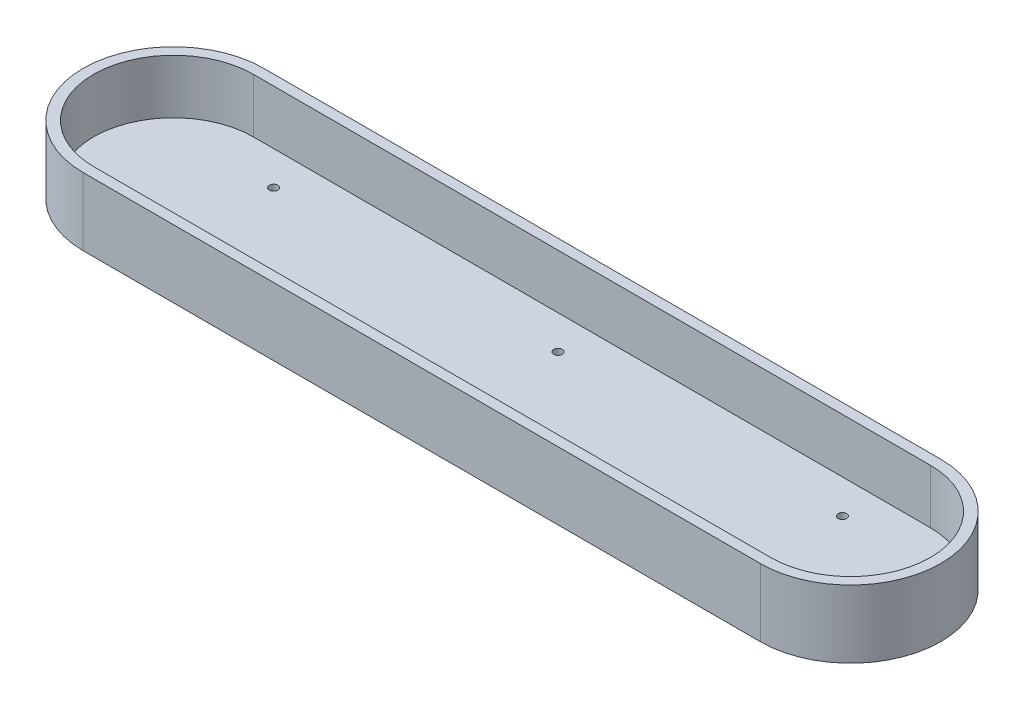
ISO-10303-21;
HEADER;
FILE_DESCRIPTION(('STEP AP214'),'2;1');
FILE_NAME('part.step','',(''),(''),'','','');
FILE_SCHEMA(('AUTOMOTIVE_DESIGN { 1 0 10303 214 1 1 1 1 }'));
ENDSEC;
DATA;
#1=APPLICATION_CONTEXT('core data for automotive mechanical design processes');
#2=APPLICATION_PROTOCOL_DEFINITION('international standard','automotive_design',2000,#1);
#3=PRODUCT_CONTEXT('',#1,'mechanical');
#4=PRODUCT('Part','Part','',(#3));
#5=PRODUCT_RELATED_PRODUCT_CATEGORY('part','',(#4));
#6=PRODUCT_DEFINITION_FORMATION('','',#4);
#7=PRODUCT_DEFINITION_CONTEXT('part definition',#1,'design');
#8=PRODUCT_DEFINITION('design','',#6,#7);
#9=PRODUCT_DEFINITION_SHAPE('','',#8);
#10=(LENGTH_UNIT() NAMED_UNIT(*) SI_UNIT(.MILLI.,.METRE.));
#11=(NAMED_UNIT(*) PLANE_ANGLE_UNIT() SI_UNIT($,.RADIAN.));
#12=(NAMED_UNIT(*) SI_UNIT($,.STERADIAN.) SOLID_ANGLE_UNIT());
#13=UNCERTAINTY_MEASURE_WITH_UNIT(LENGTH_MEASURE(1.E-05),#10,'distance_accuracy_value','');
#14=(GEOMETRIC_REPRESENTATION_CONTEXT(3) GLOBAL_UNCERTAINTY_ASSIGNED_CONTEXT((#13)) GLOBAL_UNIT_ASSIGNED_CONTEXT((#10,
#11,#12)) REPRESENTATION_CONTEXT('',''));
#15=CARTESIAN_POINT('',(0.,0.,0.));
#16=DIRECTION('',(0.,0.,1.));
#17=DIRECTION('',(1.,0.,0.));
#18=AXIS2_PLACEMENT_3D('',#15,#16,#17);
#19=CARTESIAN_POINT('',(-95.25,3.81,0.));
#20=DIRECTION('',(0.,1.,0.));
#21=DIRECTION('',(0.,0.,1.));
#22=AXIS2_PLACEMENT_3D('',#19,#20,#21);
#23=PLANE('',#22);
#24=CARTESIAN_POINT('',(-80.01,3.81,12.954));
#25=DIRECTION('',(0.,1.,0.));
#26=DIRECTION('',(0.,0.,1.));
#27=AXIS2_PLACEMENT_3D('',#24,#25,#26);
#28=CIRCLE('',#27,1.2065);
#29=CARTESIAN_POINT('',(-80.01,3.81,11.7475));
#30=VERTEX_POINT('',#29);
#31=EDGE_CURVE('E131',#30,#30,#28,.T.);
#32=ORIENTED_EDGE('',*,*,#31,.F.);
#33=EDGE_LOOP('',(#32));
#34=FACE_BOUND('',#33,.T.);
#35=CARTESIAN_POINT('',(80.01,3.81,12.954));
#36=DIRECTION('',(0.,1.,0.));
#37=DIRECTION('',(0.,0.,1.));
#38=AXIS2_PLACEMENT_3D('',#35,#36,#37);
#39=CIRCLE('',#38,1.2065);
#40=CARTESIAN_POINT('',(80.01,3.81,11.7475));
#41=VERTEX_POINT('',#40);
#42=EDGE_CURVE('E134',#41,#41,#39,.T.);
#43=ORIENTED_EDGE('',*,*,#42,.F.);
#44=EDGE_LOOP('',(#43));
#45=FACE_BOUND('',#44,.T.);
#46=CARTESIAN_POINT('',(80.01,3.81,-12.954));
#47=DIRECTION('',(0.,1.,0.));
#48=DIRECTION('',(0.,0.,1.));
#49=AXIS2_PLACEMENT_3D('',#46,#47,#48);
#50=CIRCLE('',#49,1.2065);
#51=CARTESIAN_POINT('',(80.01,3.81,-14.1605));
#52=VERTEX_POINT('',#51);
#53=EDGE_CURVE('E275',#52,#52,#50,.T.);
#54=ORIENTED_EDGE('',*,*,#53,.F.);
#55=EDGE_LOOP('',(#54));
#56=FACE_BOUND('',#55,.T.);
#57=CARTESIAN_POINT('',(-80.01,3.81,-12.954));
#58=DIRECTION('',(0.,1.,0.));
#59=DIRECTION('',(0.,0.,1.));
#60=AXIS2_PLACEMENT_3D('',#57,#58,#59);
#61=CIRCLE('',#60,1.2065);
#62=CARTESIAN_POINT('',(-80.01,3.81,-14.1605));
#63=VERTEX_POINT('',#62);
#64=EDGE_CURVE('E272',#63,#63,#61,.T.);
#65=ORIENTED_EDGE('',*,*,#64,.F.);
#66=EDGE_LOOP('',(#65));
#67=FACE_BOUND('',#66,.T.);
#68=CARTESIAN_POINT('',(0.,3.81,-12.954));
#69=DIRECTION('',(0.,1.,0.));
#70=DIRECTION('',(0.,0.,1.));
#71=AXIS2_PLACEMENT_3D('',#68,#69,#70);
#72=CIRCLE('',#71,1.2065);
#73=CARTESIAN_POINT('',(0.,3.81,-14.1605));
#74=VERTEX_POINT('',#73);
#75=EDGE_CURVE('E264',#74,#74,#72,.T.);
#76=ORIENTED_EDGE('',*,*,#75,.F.);
#77=EDGE_LOOP('',(#76));
#78=FACE_BOUND('',#77,.T.);
#79=CARTESIAN_POINT('',(0.,3.81,12.954));
#80=DIRECTION('',(0.,1.,0.));
#81=DIRECTION('',(0.,0.,1.));
#82=AXIS2_PLACEMENT_3D('',#79,#80,#81);
#83=CIRCLE('',#82,1.2065);
#84=CARTESIAN_POINT('',(0.,3.81,11.7475));
#85=VERTEX_POINT('',#84);
#86=EDGE_CURVE('E261',#85,#85,#83,.T.);
#87=ORIENTED_EDGE('',*,*,#86,.F.);
#88=EDGE_LOOP('',(#87));
#89=FACE_BOUND('',#88,.T.);
#90=CARTESIAN_POINT('',(-95.25,3.81,0.));
#91=DIRECTION('',(0.,1.,0.));
#92=DIRECTION('',(0.,0.,1.));
#93=AXIS2_PLACEMENT_3D('',#90,#91,#92);
#94=CIRCLE('',#93,22.479);
#95=CARTESIAN_POINT('',(-95.25,3.81,-22.479));
#96=VERTEX_POINT('',#95);
#97=CARTESIAN_POINT('',(-95.25,3.81,22.479));
#98=VERTEX_POINT('',#97);
#99=EDGE_CURVE('E115',#96,#98,#94,.T.);
#100=ORIENTED_EDGE('',*,*,#99,.T.);
#101=DIRECTION('',(1.,0.,0.));
#102=VECTOR('',#101,1.);
#103=CARTESIAN_POINT('',(-95.25,3.81,22.479));
#104=LINE('',#103,#102);
#105=CARTESIAN_POINT('',(95.25,3.81,22.479));
#106=VERTEX_POINT('',#105);
#107=EDGE_CURVE('E68',#98,#106,#104,.T.);
#108=ORIENTED_EDGE('',*,*,#107,.T.);
#109=CARTESIAN_POINT('',(95.25,3.81,0.));
#110=DIRECTION('',(0.,1.,0.));
#111=DIRECTION('',(0.,0.,-1.));
#112=AXIS2_PLACEMENT_3D('',#109,#110,#111);
#113=CIRCLE('',#112,22.479);
#114=CARTESIAN_POINT('',(95.25,3.81,-22.479));
#115=VERTEX_POINT('',#114);
#116=EDGE_CURVE('E53',#106,#115,#113,.T.);
#117=ORIENTED_EDGE('',*,*,#116,.T.);
#118=DIRECTION('',(-1.,0.,0.));
#119=VECTOR('',#118,1.);
#120=CARTESIAN_POINT('',(-95.25,3.81,-22.479));
#121=LINE('',#120,#119);
#122=EDGE_CURVE('E11',#115,#96,#121,.T.);
#123=ORIENTED_EDGE('',*,*,#122,.T.);
#124=EDGE_LOOP('',(#100,#108,#117,#123));
#125=FACE_BOUND('',#124,.T.);
#126=ADVANCED_FACE('F45',(#34,#45,#56,#67,#78,#89,#125),#23,.T.);
#127=CARTESIAN_POINT('',(-95.25,19.05,0.));
#128=DIRECTION('',(0.,-1.,0.));
#129=DIRECTION('',(0.,0.,-1.));
#130=AXIS2_PLACEMENT_3D('',#127,#128,#129);
#131=CYLINDRICAL_SURFACE('',#130,25.4);
#132=CARTESIAN_POINT('',(-95.25,0.,0.));
#133=DIRECTION('',(0.,-1.,0.));
#134=DIRECTION('',(0.,0.,-1.));
#135=AXIS2_PLACEMENT_3D('',#132,#133,#134);
#136=CIRCLE('',#135,25.4);
#137=CARTESIAN_POINT('',(-95.25,0.,25.4));
#138=VERTEX_POINT('',#137);
#139=CARTESIAN_POINT('',(-95.25,0.,-25.4));
#140=VERTEX_POINT('',#139);
#141=EDGE_CURVE('E142',#138,#140,#136,.T.);
#142=ORIENTED_EDGE('',*,*,#141,.F.);
#143=DIRECTION('',(0.,-1.,0.));
#144=VECTOR('',#143,1.);
#145=CARTESIAN_POINT('',(-95.25,19.05,25.4));
#146=LINE('',#145,#144);
#147=CARTESIAN_POINT('',(-95.25,19.05,25.4));
#148=VERTEX_POINT('',#147);
#149=EDGE_CURVE('E170',#148,#138,#146,.T.);
#150=ORIENTED_EDGE('',*,*,#149,.F.);
#151=CARTESIAN_POINT('',(-95.25,19.05,0.));
#152=DIRECTION('',(0.,-1.,0.));
#153=DIRECTION('',(0.,0.,-1.));
#154=AXIS2_PLACEMENT_3D('',#151,#152,#153);
#155=CIRCLE('',#154,25.4);
#156=CARTESIAN_POINT('',(-95.25,19.05,-25.4));
#157=VERTEX_POINT('',#156);
#158=EDGE_CURVE('E146',#148,#157,#155,.T.);
#159=ORIENTED_EDGE('',*,*,#158,.T.);
#160=DIRECTION('',(0.,-1.,0.));
#161=VECTOR('',#160,1.);
#162=CARTESIAN_POINT('',(-95.25,19.05,-25.4));
#163=LINE('',#162,#161);
#164=EDGE_CURVE('E159',#157,#140,#163,.T.);
#165=ORIENTED_EDGE('',*,*,#164,.T.);
#166=EDGE_LOOP('',(#142,#150,#159,#165));
#167=FACE_BOUND('',#166,.T.);
#168=ADVANCED_FACE('F193',(#167),#131,.T.);
#169=CARTESIAN_POINT('',(-95.25,19.05,25.4));
#170=DIRECTION('',(0.,0.,1.));
#171=DIRECTION('',(1.,0.,0.));
#172=AXIS2_PLACEMENT_3D('',#169,#170,#171);
#173=PLANE('',#172);
#174=DIRECTION('',(-1.,0.,0.));
#175=VECTOR('',#174,1.);
#176=CARTESIAN_POINT('',(-95.25,0.,25.4));
#177=LINE('',#176,#175);
#178=CARTESIAN_POINT('',(95.25,0.,25.4));
#179=VERTEX_POINT('',#178);
#180=EDGE_CURVE('E150',#179,#138,#177,.T.);
#181=ORIENTED_EDGE('',*,*,#180,.F.);
#182=DIRECTION('',(0.,-1.,0.));
#183=VECTOR('',#182,1.);
#184=CARTESIAN_POINT('',(95.25,19.05,25.4));
#185=LINE('',#184,#183);
#186=CARTESIAN_POINT('',(95.25,19.05,25.4));
#187=VERTEX_POINT('',#186);
#188=EDGE_CURVE('E172',#187,#179,#185,.T.);
#189=ORIENTED_EDGE('',*,*,#188,.F.);
#190=DIRECTION('',(-1.,0.,0.));
#191=VECTOR('',#190,1.);
#192=CARTESIAN_POINT('',(-95.25,19.05,25.4));
#193=LINE('',#192,#191);
#194=EDGE_CURVE('E156',#187,#148,#193,.T.);
#195=ORIENTED_EDGE('',*,*,#194,.T.);
#196=ORIENTED_EDGE('',*,*,#149,.T.);
#197=EDGE_LOOP('',(#181,#189,#195,#196));
#198=FACE_BOUND('',#197,.T.);
#199=ADVANCED_FACE('F200',(#198),#173,.T.);
#200=CARTESIAN_POINT('',(95.25,19.05,0.));
#201=DIRECTION('',(0.,-1.,0.));
#202=DIRECTION('',(0.,0.,-1.));
#203=AXIS2_PLACEMENT_3D('',#200,#201,#202);
#204=CYLINDRICAL_SURFACE('',#203,25.4);
#205=CARTESIAN_POINT('',(95.25,0.,0.));
#206=DIRECTION('',(0.,-1.,0.));
#207=DIRECTION('',(0.,0.,1.));
#208=AXIS2_PLACEMENT_3D('',#205,#206,#207);
#209=CIRCLE('',#208,25.4);
#210=CARTESIAN_POINT('',(95.25,0.,-25.4));
#211=VERTEX_POINT('',#210);
#212=EDGE_CURVE('E165',#211,#179,#209,.T.);
#213=ORIENTED_EDGE('',*,*,#212,.F.);
#214=DIRECTION('',(0.,-1.,0.));
#215=VECTOR('',#214,1.);
#216=CARTESIAN_POINT('',(95.25,19.05,-25.4));
#217=LINE('',#216,#215);
#218=CARTESIAN_POINT('',(95.25,19.05,-25.4));
#219=VERTEX_POINT('',#218);
#220=EDGE_CURVE('E174',#219,#211,#217,.T.);
#221=ORIENTED_EDGE('',*,*,#220,.F.);
#222=CARTESIAN_POINT('',(95.25,19.05,0.));
#223=DIRECTION('',(0.,-1.,0.));
#224=DIRECTION('',(0.,0.,1.));
#225=AXIS2_PLACEMENT_3D('',#222,#223,#224);
#226=CIRCLE('',#225,25.4);
#227=EDGE_CURVE('E153',#219,#187,#226,.T.);
#228=ORIENTED_EDGE('',*,*,#227,.T.);
#229=ORIENTED_EDGE('',*,*,#188,.T.);
#230=EDGE_LOOP('',(#213,#221,#228,#229));
#231=FACE_BOUND('',#230,.T.);
#232=ADVANCED_FACE('F209',(#231),#204,.T.);
#233=CARTESIAN_POINT('',(-95.25,19.05,-25.4));
#234=DIRECTION('',(0.,0.,-1.));
#235=DIRECTION('',(-1.,0.,0.));
#236=AXIS2_PLACEMENT_3D('',#233,#234,#235);
#237=PLANE('',#236);
#238=DIRECTION('',(1.,0.,0.));
#239=VECTOR('',#238,1.);
#240=CARTESIAN_POINT('',(-95.25,0.,-25.4));
#241=LINE('',#240,#239);
#242=EDGE_CURVE('E162',#140,#211,#241,.T.);
#243=ORIENTED_EDGE('',*,*,#242,.F.);
#244=ORIENTED_EDGE('',*,*,#164,.F.);
#245=DIRECTION('',(1.,0.,0.));
#246=VECTOR('',#245,1.);
#247=CARTESIAN_POINT('',(-95.25,19.05,-25.4));
#248=LINE('',#247,#246);
#249=EDGE_CURVE('E149',#157,#219,#248,.T.);
#250=ORIENTED_EDGE('',*,*,#249,.T.);
#251=ORIENTED_EDGE('',*,*,#220,.T.);
#252=EDGE_LOOP('',(#243,#244,#250,#251));
#253=FACE_BOUND('',#252,.T.);
#254=ADVANCED_FACE('F206',(#253),#237,.T.);
#255=CARTESIAN_POINT('',(-95.25,19.05,0.));
#256=DIRECTION('',(0.,-1.,0.));
#257=DIRECTION('',(0.,0.,-1.));
#258=AXIS2_PLACEMENT_3D('',#255,#256,#257);
#259=PLANE('',#258);
#260=DIRECTION('',(-1.,0.,0.));
#261=VECTOR('',#260,1.);
#262=CARTESIAN_POINT('',(95.25,19.05,22.479));
#263=LINE('',#262,#261);
#264=CARTESIAN_POINT('',(95.25,19.05,22.479));
#265=VERTEX_POINT('',#264);
#266=CARTESIAN_POINT('',(-95.25,19.05,22.479));
#267=VERTEX_POINT('',#266);
#268=EDGE_CURVE('E117',#265,#267,#263,.T.);
#269=ORIENTED_EDGE('',*,*,#268,.T.);
#270=CARTESIAN_POINT('',(-95.25,19.05,0.));
#271=DIRECTION('',(0.,-1.,0.));
#272=DIRECTION('',(0.,0.,-1.));
#273=AXIS2_PLACEMENT_3D('',#270,#271,#272);
#274=CIRCLE('',#273,22.479);
#275=CARTESIAN_POINT('',(-95.25,19.05,-22.479));
#276=VERTEX_POINT('',#275);
#277=EDGE_CURVE('E112',#267,#276,#274,.T.);
#278=ORIENTED_EDGE('',*,*,#277,.T.);
#279=DIRECTION('',(1.,0.,0.));
#280=VECTOR('',#279,1.);
#281=CARTESIAN_POINT('',(95.25,19.05,-22.479));
#282=LINE('',#281,#280);
#283=CARTESIAN_POINT('',(95.25,19.05,-22.479));
#284=VERTEX_POINT('',#283);
#285=EDGE_CURVE('E121',#276,#284,#282,.T.);
#286=ORIENTED_EDGE('',*,*,#285,.T.);
#287=CARTESIAN_POINT('',(95.25,19.05,0.));
#288=DIRECTION('',(0.,-1.,0.));
#289=DIRECTION('',(0.,0.,1.));
#290=AXIS2_PLACEMENT_3D('',#287,#288,#289);
#291=CIRCLE('',#290,22.479);
#292=EDGE_CURVE('E126',#284,#265,#291,.T.);
#293=ORIENTED_EDGE('',*,*,#292,.T.);
#294=EDGE_LOOP('',(#269,#278,#286,#293));
#295=FACE_BOUND('',#294,.T.);
#296=ORIENTED_EDGE('',*,*,#158,.F.);
#297=ORIENTED_EDGE('',*,*,#194,.F.);
#298=ORIENTED_EDGE('',*,*,#227,.F.);
#299=ORIENTED_EDGE('',*,*,#249,.F.);
#300=EDGE_LOOP('',(#296,#297,#298,#299));
#301=FACE_BOUND('',#300,.T.);
#302=ADVANCED_FACE('F128',(#295,#301),#259,.F.);
#303=CARTESIAN_POINT('',(-95.25,19.05,0.));
#304=DIRECTION('',(0.,-1.,0.));
#305=DIRECTION('',(0.,0.,-1.));
#306=AXIS2_PLACEMENT_3D('',#303,#304,#305);
#307=CYLINDRICAL_SURFACE('',#306,22.479);
#308=ORIENTED_EDGE('',*,*,#99,.F.);
#309=DIRECTION('',(0.,-1.,0.));
#310=VECTOR('',#309,1.);
#311=CARTESIAN_POINT('',(-95.25,19.05,-22.479));
#312=LINE('',#311,#310);
#313=EDGE_CURVE('E60',#276,#96,#312,.T.);
#314=ORIENTED_EDGE('',*,*,#313,.F.);
#315=ORIENTED_EDGE('',*,*,#277,.F.);
#316=DIRECTION('',(0.,-1.,0.));
#317=VECTOR('',#316,1.);
#318=CARTESIAN_POINT('',(-95.25,19.05,22.479));
#319=LINE('',#318,#317);
#320=EDGE_CURVE('E140',#267,#98,#319,.T.);
#321=ORIENTED_EDGE('',*,*,#320,.T.);
#322=EDGE_LOOP('',(#308,#314,#315,#321));
#323=FACE_BOUND('',#322,.T.);
#324=ADVANCED_FACE('F110',(#323),#307,.F.);
#325=CARTESIAN_POINT('',(95.25,19.05,22.479));
#326=DIRECTION('',(0.,0.,1.));
#327=DIRECTION('',(1.,0.,0.));
#328=AXIS2_PLACEMENT_3D('',#325,#326,#327);
#329=PLANE('',#328);
#330=ORIENTED_EDGE('',*,*,#107,.F.);
#331=ORIENTED_EDGE('',*,*,#320,.F.);
#332=ORIENTED_EDGE('',*,*,#268,.F.);
#333=DIRECTION('',(0.,-1.,0.));
#334=VECTOR('',#333,1.);
#335=CARTESIAN_POINT('',(95.25,19.05,22.479));
#336=LINE('',#335,#334);
#337=EDGE_CURVE('E143',#265,#106,#336,.T.);
#338=ORIENTED_EDGE('',*,*,#337,.T.);
#339=EDGE_LOOP('',(#330,#331,#332,#338));
#340=FACE_BOUND('',#339,.T.);
#341=ADVANCED_FACE('F182',(#340),#329,.F.);
#342=CARTESIAN_POINT('',(95.25,19.05,0.));
#343=DIRECTION('',(0.,-1.,0.));
#344=DIRECTION('',(0.,0.,-1.));
#345=AXIS2_PLACEMENT_3D('',#342,#343,#344);
#346=CYLINDRICAL_SURFACE('',#345,22.479);
#347=ORIENTED_EDGE('',*,*,#116,.F.);
#348=ORIENTED_EDGE('',*,*,#337,.F.);
#349=ORIENTED_EDGE('',*,*,#292,.F.);
#350=DIRECTION('',(0.,-1.,0.));
#351=VECTOR('',#350,1.);
#352=CARTESIAN_POINT('',(95.25,19.05,-22.479));
#353=LINE('',#352,#351);
#354=EDGE_CURVE('E116',#284,#115,#353,.T.);
#355=ORIENTED_EDGE('',*,*,#354,.T.);
#356=EDGE_LOOP('',(#347,#348,#349,#355));
#357=FACE_BOUND('',#356,.T.);
#358=ADVANCED_FACE('F181',(#357),#346,.F.);
#359=CARTESIAN_POINT('',(95.25,19.05,-22.479));
#360=DIRECTION('',(0.,0.,-1.));
#361=DIRECTION('',(-1.,0.,0.));
#362=AXIS2_PLACEMENT_3D('',#359,#360,#361);
#363=PLANE('',#362);
#364=ORIENTED_EDGE('',*,*,#122,.F.);
#365=ORIENTED_EDGE('',*,*,#354,.F.);
#366=ORIENTED_EDGE('',*,*,#285,.F.);
#367=ORIENTED_EDGE('',*,*,#313,.T.);
#368=EDGE_LOOP('',(#364,#365,#366,#367));
#369=FACE_BOUND('',#368,.T.);
#370=ADVANCED_FACE('F122',(#369),#363,.F.);
#371=CARTESIAN_POINT('',(-95.25,0.,0.));
#372=DIRECTION('',(0.,1.,0.));
#373=DIRECTION('',(0.,0.,1.));
#374=AXIS2_PLACEMENT_3D('',#371,#372,#373);
#375=PLANE('',#374);
#376=CARTESIAN_POINT('',(-80.01,0.,12.954));
#377=DIRECTION('',(0.,-1.,0.));
#378=DIRECTION('',(0.,0.,-1.));
#379=AXIS2_PLACEMENT_3D('',#376,#377,#378);
#380=CIRCLE('',#379,1.2065);
#381=CARTESIAN_POINT('',(-80.01,0.,11.7475));
#382=VERTEX_POINT('',#381);
#383=EDGE_CURVE('E231',#382,#382,#380,.T.);
#384=ORIENTED_EDGE('',*,*,#383,.F.);
#385=EDGE_LOOP('',(#384));
#386=FACE_BOUND('',#385,.T.);
#387=CARTESIAN_POINT('',(80.01,0.,12.954));
#388=DIRECTION('',(0.,-1.,0.));
#389=DIRECTION('',(0.,0.,1.));
#390=AXIS2_PLACEMENT_3D('',#387,#388,#389);
#391=CIRCLE('',#390,1.2065);
#392=CARTESIAN_POINT('',(80.01,0.,11.7475));
#393=VERTEX_POINT('',#392);
#394=EDGE_CURVE('E235',#393,#393,#391,.T.);
#395=ORIENTED_EDGE('',*,*,#394,.F.);
#396=EDGE_LOOP('',(#395));
#397=FACE_BOUND('',#396,.T.);
#398=CARTESIAN_POINT('',(80.01,0.,-12.954));
#399=DIRECTION('',(0.,-1.,0.));
#400=DIRECTION('',(0.,0.,-1.));
#401=AXIS2_PLACEMENT_3D('',#398,#399,#400);
#402=CIRCLE('',#401,1.2065);
#403=CARTESIAN_POINT('',(80.01,0.,-14.1605));
#404=VERTEX_POINT('',#403);
#405=EDGE_CURVE('E239',#404,#404,#402,.T.);
#406=ORIENTED_EDGE('',*,*,#405,.F.);
#407=EDGE_LOOP('',(#406));
#408=FACE_BOUND('',#407,.T.);
#409=CARTESIAN_POINT('',(-80.01,0.,-12.954));
#410=DIRECTION('',(0.,-1.,0.));
#411=DIRECTION('',(0.,0.,1.));
#412=AXIS2_PLACEMENT_3D('',#409,#410,#411);
#413=CIRCLE('',#412,1.2065);
#414=CARTESIAN_POINT('',(-80.01,0.,-14.1605));
#415=VERTEX_POINT('',#414);
#416=EDGE_CURVE('E243',#415,#415,#413,.T.);
#417=ORIENTED_EDGE('',*,*,#416,.F.);
#418=EDGE_LOOP('',(#417));
#419=FACE_BOUND('',#418,.T.);
#420=CARTESIAN_POINT('',(0.,0.,-12.954));
#421=DIRECTION('',(0.,-1.,0.));
#422=DIRECTION('',(0.,0.,1.));
#423=AXIS2_PLACEMENT_3D('',#420,#421,#422);
#424=CIRCLE('',#423,1.2065);
#425=CARTESIAN_POINT('',(0.,0.,-14.1605));
#426=VERTEX_POINT('',#425);
#427=EDGE_CURVE('E247',#426,#426,#424,.T.);
#428=ORIENTED_EDGE('',*,*,#427,.F.);
#429=EDGE_LOOP('',(#428));
#430=FACE_BOUND('',#429,.T.);
#431=CARTESIAN_POINT('',(0.,0.,12.954));
#432=DIRECTION('',(0.,-1.,0.));
#433=DIRECTION('',(0.,0.,-1.));
#434=AXIS2_PLACEMENT_3D('',#431,#432,#433);
#435=CIRCLE('',#434,1.2065);
#436=CARTESIAN_POINT('',(0.,0.,11.7475));
#437=VERTEX_POINT('',#436);
#438=EDGE_CURVE('E251',#437,#437,#435,.T.);
#439=ORIENTED_EDGE('',*,*,#438,.F.);
#440=EDGE_LOOP('',(#439));
#441=FACE_BOUND('',#440,.T.);
#442=ORIENTED_EDGE('',*,*,#141,.T.);
#443=ORIENTED_EDGE('',*,*,#242,.T.);
#444=ORIENTED_EDGE('',*,*,#212,.T.);
#445=ORIENTED_EDGE('',*,*,#180,.T.);
#446=EDGE_LOOP('',(#442,#443,#444,#445));
#447=FACE_BOUND('',#446,.T.);
#448=ADVANCED_FACE('F47',(#386,#397,#408,#419,#430,#441,#447),#375,.F.);
#449=CARTESIAN_POINT('',(0.,19.05,12.954));
#450=DIRECTION('',(0.,-1.,0.));
#451=DIRECTION('',(0.,0.,-1.));
#452=AXIS2_PLACEMENT_3D('',#449,#450,#451);
#453=CYLINDRICAL_SURFACE('',#452,1.2065);
#454=CARTESIAN_POINT('',(0.,3.81,11.7475));
#455=CARTESIAN_POINT('',(0.,3.7703125,11.7475));
#456=CARTESIAN_POINT('',(0.,3.730625,11.7475));
#457=CARTESIAN_POINT('',(0.,3.65125,11.7475));
#458=CARTESIAN_POINT('',(0.,3.6115625,11.7475));
#459=CARTESIAN_POINT('',(0.,3.5321875,11.7475));
#460=CARTESIAN_POINT('',(0.,3.4925,11.7475));
#461=CARTESIAN_POINT('',(0.,3.413125,11.7475));
#462=CARTESIAN_POINT('',(0.,3.3734375,11.7475));
#463=CARTESIAN_POINT('',(0.,3.2940625,11.7475));
#464=CARTESIAN_POINT('',(0.,3.254375,11.7475));
#465=CARTESIAN_POINT('',(0.,3.175,11.7475));
#466=CARTESIAN_POINT('',(0.,3.1353125,11.7475));
#467=CARTESIAN_POINT('',(0.,3.0559375,11.7475));
#468=CARTESIAN_POINT('',(0.,3.01625,11.7475));
#469=CARTESIAN_POINT('',(0.,2.936875,11.7475));
#470=CARTESIAN_POINT('',(0.,2.8971875,11.7475));
#471=CARTESIAN_POINT('',(0.,2.8178125,11.7475));
#472=CARTESIAN_POINT('',(0.,2.778125,11.7475));
#473=CARTESIAN_POINT('',(0.,2.69875,11.7475));
#474=CARTESIAN_POINT('',(0.,2.6590625,11.7475));
#475=CARTESIAN_POINT('',(0.,2.5796875,11.7475));
#476=CARTESIAN_POINT('',(0.,2.54,11.7475));
#477=CARTESIAN_POINT('',(0.,2.460625,11.7475));
#478=CARTESIAN_POINT('',(0.,2.4209375,11.7475));
#479=CARTESIAN_POINT('',(0.,2.3415625,11.7475));
#480=CARTESIAN_POINT('',(0.,2.301875,11.7475));
#481=CARTESIAN_POINT('',(0.,2.2225,11.7475));
#482=CARTESIAN_POINT('',(0.,2.1828125,11.7475));
#483=CARTESIAN_POINT('',(0.,2.1034375,11.7475));
#484=CARTESIAN_POINT('',(0.,2.06375,11.7475));
#485=CARTESIAN_POINT('',(0.,1.984375,11.7475));
#486=CARTESIAN_POINT('',(0.,1.9446875,11.7475));
#487=CARTESIAN_POINT('',(0.,1.8653125,11.7475));
#488=CARTESIAN_POINT('',(0.,1.825625,11.7475));
#489=CARTESIAN_POINT('',(0.,1.74625,11.7475));
#490=CARTESIAN_POINT('',(0.,1.7065625,11.7475));
#491=CARTESIAN_POINT('',(0.,1.6271875,11.7475));
#492=CARTESIAN_POINT('',(0.,1.5875,11.7475));
#493=CARTESIAN_POINT('',(0.,1.508125,11.7475));
#494=CARTESIAN_POINT('',(0.,1.4684375,11.7475));
#495=CARTESIAN_POINT('',(0.,1.3890625,11.7475));
#496=CARTESIAN_POINT('',(0.,1.349375,11.7475));
#497=CARTESIAN_POINT('',(0.,1.27,11.7475));
#498=CARTESIAN_POINT('',(0.,1.2303125,11.7475));
#499=CARTESIAN_POINT('',(0.,1.1509375,11.7475));
#500=CARTESIAN_POINT('',(0.,1.11125,11.7475));
#501=CARTESIAN_POINT('',(0.,1.031875,11.7475));
#502=CARTESIAN_POINT('',(0.,0.992187500000002,11.7475));
#503=CARTESIAN_POINT('',(0.,0.912812500000001,11.7475));
#504=CARTESIAN_POINT('',(0.,0.873125,11.7475));
#505=CARTESIAN_POINT('',(0.,0.793749999999999,11.7475));
#506=CARTESIAN_POINT('',(0.,0.7540625,11.7475));
#507=CARTESIAN_POINT('',(0.,0.6746875,11.7475));
#508=CARTESIAN_POINT('',(0.,0.635,11.7475));
#509=CARTESIAN_POINT('',(0.,0.555625000000001,11.7475));
#510=CARTESIAN_POINT('',(0.,0.515937500000001,11.7475));
#511=CARTESIAN_POINT('',(0.,0.436562500000001,11.7475));
#512=CARTESIAN_POINT('',(0.,0.396875000000001,11.7475));
#513=CARTESIAN_POINT('',(0.,0.317500000000001,11.7475));
#514=CARTESIAN_POINT('',(0.,0.2778125,11.7475));
#515=CARTESIAN_POINT('',(0.,0.198437499999999,11.7475));
#516=CARTESIAN_POINT('',(0.,0.158749999999999,11.7475));
#517=CARTESIAN_POINT('',(0.,0.0793749999999996,11.7475));
#518=CARTESIAN_POINT('',(0.,0.0396874999999998,11.7475));
#519=CARTESIAN_POINT('',(0.,0.,11.7475));
#520=B_SPLINE_CURVE_WITH_KNOTS('',3,(#454,#455,#456,#457,#458,#459,#460,#461,#462,#463,#464,
#465,#466,#467,#468,#469,#470,#471,#472,#473,#474,#475,#476,#477,#478,#479,#480,#481,#482,#483,
#484,#485,#486,#487,#488,#489,#490,#491,#492,#493,#494,#495,#496,#497,#498,#499,#500,#501,#502,
#503,#504,#505,#506,#507,#508,#509,#510,#511,#512,#513,#514,#515,#516,#517,#518,#519),
.UNSPECIFIED.,.F.,.F.,(4,2,2,2,2,2,2,2,2,2,2,2,2,2,2,2,2,2,2,2,2,2,2,2,2,2,2,2,2,2,2,2,4),(0.,
0.119062499999999,0.238125,0.3571875,0.476249999999999,0.595312499999999,0.714374999999998,
0.833437499999997,0.9525,1.0715625,1.190625,1.3096875,1.42875,1.5478125,1.666875,1.7859375,
1.905,2.0240625,2.143125,2.2621875,2.38125,2.5003125,2.619375,2.7384375,2.8575,2.9765625,
3.095625,3.2146875,3.33375,3.4528125,3.571875,3.6909375,3.81),.UNSPECIFIED.);
#521=EDGE_CURVE('BSEAM221',#85,#437,#520,.T.);
#522=ORIENTED_EDGE('',*,*,#86,.T.);
#523=ORIENTED_EDGE('',*,*,#438,.T.);
#524=ORIENTED_EDGE('',*,*,#521,.T.);
#525=ORIENTED_EDGE('',*,*,#521,.F.);
#526=EDGE_LOOP('',(#522,#524,#523,#525));
#527=FACE_BOUND('',#526,.T.);
#528=ADVANCED_FACE('F221',(#527),#453,.F.);
#529=CARTESIAN_POINT('',(0.,19.05,-12.954));
#530=DIRECTION('',(0.,-1.,0.));
#531=DIRECTION('',(0.,0.,-1.));
#532=AXIS2_PLACEMENT_3D('',#529,#530,#531);
#533=CYLINDRICAL_SURFACE('',#532,1.2065);
#534=CARTESIAN_POINT('',(0.,3.81,-14.1605));
#535=CARTESIAN_POINT('',(0.,3.7703125,-14.1605));
#536=CARTESIAN_POINT('',(0.,3.730625,-14.1605));
#537=CARTESIAN_POINT('',(0.,3.65125,-14.1605));
#538=CARTESIAN_POINT('',(0.,3.6115625,-14.1605));
#539=CARTESIAN_POINT('',(0.,3.5321875,-14.1605));
#540=CARTESIAN_POINT('',(0.,3.4925,-14.1605));
#541=CARTESIAN_POINT('',(0.,3.413125,-14.1605));
#542=CARTESIAN_POINT('',(0.,3.3734375,-14.1605));
#543=CARTESIAN_POINT('',(0.,3.2940625,-14.1605));
#544=CARTESIAN_POINT('',(0.,3.254375,-14.1605));
#545=CARTESIAN_POINT('',(0.,3.175,-14.1605));
#546=CARTESIAN_POINT('',(0.,3.1353125,-14.1605));
#547=CARTESIAN_POINT('',(0.,3.0559375,-14.1605));
#548=CARTESIAN_POINT('',(0.,3.01625,-14.1605));
#549=CARTESIAN_POINT('',(0.,2.936875,-14.1605));
#550=CARTESIAN_POINT('',(0.,2.8971875,-14.1605));
#551=CARTESIAN_POINT('',(0.,2.8178125,-14.1605));
#552=CARTESIAN_POINT('',(0.,2.778125,-14.1605));
#553=CARTESIAN_POINT('',(0.,2.69875,-14.1605));
#554=CARTESIAN_POINT('',(0.,2.6590625,-14.1605));
#555=CARTESIAN_POINT('',(0.,2.5796875,-14.1605));
#556=CARTESIAN_POINT('',(0.,2.54,-14.1605));
#557=CARTESIAN_POINT('',(0.,2.460625,-14.1605));
#558=CARTESIAN_POINT('',(0.,2.4209375,-14.1605));
#559=CARTESIAN_POINT('',(0.,2.3415625,-14.1605));
#560=CARTESIAN_POINT('',(0.,2.301875,-14.1605));
#561=CARTESIAN_POINT('',(0.,2.2225,-14.1605));
#562=CARTESIAN_POINT('',(0.,2.1828125,-14.1605));
#563=CARTESIAN_POINT('',(0.,2.1034375,-14.1605));
#564=CARTESIAN_POINT('',(0.,2.06375,-14.1605));
#565=CARTESIAN_POINT('',(0.,1.984375,-14.1605));
#566=CARTESIAN_POINT('',(0.,1.9446875,-14.1605));
#567=CARTESIAN_POINT('',(0.,1.8653125,-14.1605));
#568=CARTESIAN_POINT('',(0.,1.825625,-14.1605));
#569=CARTESIAN_POINT('',(0.,1.74625,-14.1605));
#570=CARTESIAN_POINT('',(0.,1.7065625,-14.1605));
#571=CARTESIAN_POINT('',(0.,1.6271875,-14.1605));
#572=CARTESIAN_POINT('',(0.,1.5875,-14.1605));
#573=CARTESIAN_POINT('',(0.,1.508125,-14.1605));
#574=CARTESIAN_POINT('',(0.,1.4684375,-14.1605));
#575=CARTESIAN_POINT('',(0.,1.3890625,-14.1605));
#576=CARTESIAN_POINT('',(0.,1.349375,-14.1605));
#577=CARTESIAN_POINT('',(0.,1.27,-14.1605));
#578=CARTESIAN_POINT('',(0.,1.2303125,-14.1605));
#579=CARTESIAN_POINT('',(0.,1.1509375,-14.1605));
#580=CARTESIAN_POINT('',(0.,1.11125,-14.1605));
#581=CARTESIAN_POINT('',(0.,1.031875,-14.1605));
#582=CARTESIAN_POINT('',(0.,0.992187500000002,-14.1605));
#583=CARTESIAN_POINT('',(0.,0.912812500000001,-14.1605));
#584=CARTESIAN_POINT('',(0.,0.873125,-14.1605));
#585=CARTESIAN_POINT('',(0.,0.793749999999999,-14.1605));
#586=CARTESIAN_POINT('',(0.,0.7540625,-14.1605));
#587=CARTESIAN_POINT('',(0.,0.6746875,-14.1605));
#588=CARTESIAN_POINT('',(0.,0.635,-14.1605));
#589=CARTESIAN_POINT('',(0.,0.555625000000001,-14.1605));
#590=CARTESIAN_POINT('',(0.,0.515937500000001,-14.1605));
#591=CARTESIAN_POINT('',(0.,0.436562500000001,-14.1605));
#592=CARTESIAN_POINT('',(0.,0.396875000000001,-14.1605));
#593=CARTESIAN_POINT('',(0.,0.317500000000001,-14.1605));
#594=CARTESIAN_POINT('',(0.,0.2778125,-14.1605));
#595=CARTESIAN_POINT('',(0.,0.198437499999999,-14.1605));
#596=CARTESIAN_POINT('',(0.,0.158749999999999,-14.1605));
#597=CARTESIAN_POINT('',(0.,0.0793749999999996,-14.1605));
#598=CARTESIAN_POINT('',(0.,0.0396874999999998,-14.1605));
#599=CARTESIAN_POINT('',(0.,0.,-14.1605));
#600=B_SPLINE_CURVE_WITH_KNOTS('',3,(#534,#535,#536,#537,#538,#539,#540,#541,#542,#543,#544,
#545,#546,#547,#548,#549,#550,#551,#552,#553,#554,#555,#556,#557,#558,#559,#560,#561,#562,#563,
#564,#565,#566,#567,#568,#569,#570,#571,#572,#573,#574,#575,#576,#577,#578,#579,#580,#581,#582,
#583,#584,#585,#586,#587,#588,#589,#590,#591,#592,#593,#594,#595,#596,#597,#598,#599),
.UNSPECIFIED.,.F.,.F.,(4,2,2,2,2,2,2,2,2,2,2,2,2,2,2,2,2,2,2,2,2,2,2,2,2,2,2,2,2,2,2,2,4),(0.,
0.119062499999999,0.238125,0.3571875,0.476249999999999,0.595312499999999,0.714374999999998,
0.833437499999997,0.9525,1.0715625,1.190625,1.3096875,1.42875,1.5478125,1.666875,1.7859375,
1.905,2.0240625,2.143125,2.2621875,2.38125,2.5003125,2.619375,2.7384375,2.8575,2.9765625,
3.095625,3.2146875,3.33375,3.4528125,3.571875,3.6909375,3.81),.UNSPECIFIED.);
#601=EDGE_CURVE('BSEAM226',#74,#426,#600,.T.);
#602=ORIENTED_EDGE('',*,*,#75,.T.);
#603=ORIENTED_EDGE('',*,*,#427,.T.);
#604=ORIENTED_EDGE('',*,*,#601,.T.);
#605=ORIENTED_EDGE('',*,*,#601,.F.);
#606=EDGE_LOOP('',(#602,#604,#603,#605));
#607=FACE_BOUND('',#606,.T.);
#608=ADVANCED_FACE('F226',(#607),#533,.F.);
#609=CARTESIAN_POINT('',(-80.01,19.05,-12.954));
#610=DIRECTION('',(0.,-1.,0.));
#611=DIRECTION('',(0.,0.,-1.));
#612=AXIS2_PLACEMENT_3D('',#609,#610,#611);
#613=CYLINDRICAL_SURFACE('',#612,1.2065);
#614=CARTESIAN_POINT('',(-80.01,3.81,-14.1605));
#615=CARTESIAN_POINT('',(-80.01,3.7703125,-14.1605));
#616=CARTESIAN_POINT('',(-80.01,3.730625,-14.1605));
#617=CARTESIAN_POINT('',(-80.01,3.65125,-14.1605));
#618=CARTESIAN_POINT('',(-80.01,3.6115625,-14.1605));
#619=CARTESIAN_POINT('',(-80.01,3.5321875,-14.1605));
#620=CARTESIAN_POINT('',(-80.01,3.4925,-14.1605));
#621=CARTESIAN_POINT('',(-80.01,3.413125,-14.1605));
#622=CARTESIAN_POINT('',(-80.01,3.3734375,-14.1605));
#623=CARTESIAN_POINT('',(-80.01,3.2940625,-14.1605));
#624=CARTESIAN_POINT('',(-80.01,3.254375,-14.1605));
#625=CARTESIAN_POINT('',(-80.01,3.175,-14.1605));
#626=CARTESIAN_POINT('',(-80.01,3.1353125,-14.1605));
#627=CARTESIAN_POINT('',(-80.01,3.0559375,-14.1605));
#628=CARTESIAN_POINT('',(-80.01,3.01625,-14.1605));
#629=CARTESIAN_POINT('',(-80.01,2.936875,-14.1605));
#630=CARTESIAN_POINT('',(-80.01,2.8971875,-14.1605));
#631=CARTESIAN_POINT('',(-80.01,2.8178125,-14.1605));
#632=CARTESIAN_POINT('',(-80.01,2.778125,-14.1605));
#633=CARTESIAN_POINT('',(-80.01,2.69875,-14.1605));
#634=CARTESIAN_POINT('',(-80.01,2.6590625,-14.1605));
#635=CARTESIAN_POINT('',(-80.01,2.5796875,-14.1605));
#636=CARTESIAN_POINT('',(-80.01,2.54,-14.1605));
#637=CARTESIAN_POINT('',(-80.01,2.460625,-14.1605));
#638=CARTESIAN_POINT('',(-80.01,2.4209375,-14.1605));
#639=CARTESIAN_POINT('',(-80.01,2.3415625,-14.1605));
#640=CARTESIAN_POINT('',(-80.01,2.301875,-14.1605));
#641=CARTESIAN_POINT('',(-80.01,2.2225,-14.1605));
#642=CARTESIAN_POINT('',(-80.01,2.1828125,-14.1605));
#643=CARTESIAN_POINT('',(-80.01,2.1034375,-14.1605));
#644=CARTESIAN_POINT('',(-80.01,2.06375,-14.1605));
#645=CARTESIAN_POINT('',(-80.01,1.984375,-14.1605));
#646=CARTESIAN_POINT('',(-80.01,1.9446875,-14.1605));
#647=CARTESIAN_POINT('',(-80.01,1.8653125,-14.1605));
#648=CARTESIAN_POINT('',(-80.01,1.825625,-14.1605));
#649=CARTESIAN_POINT('',(-80.01,1.74625,-14.1605));
#650=CARTESIAN_POINT('',(-80.01,1.7065625,-14.1605));
#651=CARTESIAN_POINT('',(-80.01,1.6271875,-14.1605));
#652=CARTESIAN_POINT('',(-80.01,1.5875,-14.1605));
#653=CARTESIAN_POINT('',(-80.01,1.508125,-14.1605));
#654=CARTESIAN_POINT('',(-80.01,1.4684375,-14.1605));
#655=CARTESIAN_POINT('',(-80.01,1.3890625,-14.1605));
#656=CARTESIAN_POINT('',(-80.01,1.349375,-14.1605));
#657=CARTESIAN_POINT('',(-80.01,1.27,-14.1605));
#658=CARTESIAN_POINT('',(-80.01,1.2303125,-14.1605));
#659=CARTESIAN_POINT('',(-80.01,1.1509375,-14.1605));
#660=CARTESIAN_POINT('',(-80.01,1.11125,-14.1605));
#661=CARTESIAN_POINT('',(-80.01,1.031875,-14.1605));
#662=CARTESIAN_POINT('',(-80.01,0.992187500000002,-14.1605));
#663=CARTESIAN_POINT('',(-80.01,0.912812500000001,-14.1605));
#664=CARTESIAN_POINT('',(-80.01,0.873125,-14.1605));
#665=CARTESIAN_POINT('',(-80.01,0.793749999999999,-14.1605));
#666=CARTESIAN_POINT('',(-80.01,0.7540625,-14.1605));
#667=CARTESIAN_POINT('',(-80.01,0.6746875,-14.1605));
#668=CARTESIAN_POINT('',(-80.01,0.635,-14.1605));
#669=CARTESIAN_POINT('',(-80.01,0.555625000000001,-14.1605));
#670=CARTESIAN_POINT('',(-80.01,0.515937500000001,-14.1605));
#671=CARTESIAN_POINT('',(-80.01,0.436562500000001,-14.1605));
#672=CARTESIAN_POINT('',(-80.01,0.396875000000001,-14.1605));
#673=CARTESIAN_POINT('',(-80.01,0.317500000000001,-14.1605));
#674=CARTESIAN_POINT('',(-80.01,0.2778125,-14.1605));
#675=CARTESIAN_POINT('',(-80.01,0.198437499999999,-14.1605));
#676=CARTESIAN_POINT('',(-80.01,0.158749999999999,-14.1605));
#677=CARTESIAN_POINT('',(-80.01,0.0793749999999996,-14.1605));
#678=CARTESIAN_POINT('',(-80.01,0.0396874999999998,-14.1605));
#679=CARTESIAN_POINT('',(-80.01,0.,-14.1605));
#680=B_SPLINE_CURVE_WITH_KNOTS('',3,(#614,#615,#616,#617,#618,#619,#620,#621,#622,#623,#624,
#625,#626,#627,#628,#629,#630,#631,#632,#633,#634,#635,#636,#637,#638,#639,#640,#641,#642,#643,
#644,#645,#646,#647,#648,#649,#650,#651,#652,#653,#654,#655,#656,#657,#658,#659,#660,#661,#662,
#663,#664,#665,#666,#667,#668,#669,#670,#671,#672,#673,#674,#675,#676,#677,#678,#679),
.UNSPECIFIED.,.F.,.F.,(4,2,2,2,2,2,2,2,2,2,2,2,2,2,2,2,2,2,2,2,2,2,2,2,2,2,2,2,2,2,2,2,4),(0.,
0.119062499999999,0.238125,0.3571875,0.476249999999999,0.595312499999999,0.714374999999998,
0.833437499999997,0.9525,1.0715625,1.190625,1.3096875,1.42875,1.5478125,1.666875,1.7859375,
1.905,2.0240625,2.143125,2.2621875,2.38125,2.5003125,2.619375,2.7384375,2.8575,2.9765625,
3.095625,3.2146875,3.33375,3.4528125,3.571875,3.6909375,3.81),.UNSPECIFIED.);
#681=EDGE_CURVE('BSEAM293',#63,#415,#680,.T.);
#682=ORIENTED_EDGE('',*,*,#64,.T.);
#683=ORIENTED_EDGE('',*,*,#416,.T.);
#684=ORIENTED_EDGE('',*,*,#681,.T.);
#685=ORIENTED_EDGE('',*,*,#681,.F.);
#686=EDGE_LOOP('',(#682,#684,#683,#685));
#687=FACE_BOUND('',#686,.T.);
#688=ADVANCED_FACE('F293',(#687),#613,.F.);
#689=CARTESIAN_POINT('',(80.01,19.05,-12.954));
#690=DIRECTION('',(0.,-1.,0.));
#691=DIRECTION('',(0.,0.,-1.));
#692=AXIS2_PLACEMENT_3D('',#689,#690,#691);
#693=CYLINDRICAL_SURFACE('',#692,1.2065);
#694=CARTESIAN_POINT('',(80.01,3.81,-14.1605));
#695=CARTESIAN_POINT('',(80.01,3.7703125,-14.1605));
#696=CARTESIAN_POINT('',(80.01,3.730625,-14.1605));
#697=CARTESIAN_POINT('',(80.01,3.65125,-14.1605));
#698=CARTESIAN_POINT('',(80.01,3.6115625,-14.1605));
#699=CARTESIAN_POINT('',(80.01,3.5321875,-14.1605));
#700=CARTESIAN_POINT('',(80.01,3.4925,-14.1605));
#701=CARTESIAN_POINT('',(80.01,3.413125,-14.1605));
#702=CARTESIAN_POINT('',(80.01,3.3734375,-14.1605));
#703=CARTESIAN_POINT('',(80.01,3.2940625,-14.1605));
#704=CARTESIAN_POINT('',(80.01,3.254375,-14.1605));
#705=CARTESIAN_POINT('',(80.01,3.175,-14.1605));
#706=CARTESIAN_POINT('',(80.01,3.1353125,-14.1605));
#707=CARTESIAN_POINT('',(80.01,3.0559375,-14.1605));
#708=CARTESIAN_POINT('',(80.01,3.01625,-14.1605));
#709=CARTESIAN_POINT('',(80.01,2.936875,-14.1605));
#710=CARTESIAN_POINT('',(80.01,2.8971875,-14.1605));
#711=CARTESIAN_POINT('',(80.01,2.8178125,-14.1605));
#712=CARTESIAN_POINT('',(80.01,2.778125,-14.1605));
#713=CARTESIAN_POINT('',(80.01,2.69875,-14.1605));
#714=CARTESIAN_POINT('',(80.01,2.6590625,-14.1605));
#715=CARTESIAN_POINT('',(80.01,2.5796875,-14.1605));
#716=CARTESIAN_POINT('',(80.01,2.54,-14.1605));
#717=CARTESIAN_POINT('',(80.01,2.460625,-14.1605));
#718=CARTESIAN_POINT('',(80.01,2.4209375,-14.1605));
#719=CARTESIAN_POINT('',(80.01,2.3415625,-14.1605));
#720=CARTESIAN_POINT('',(80.01,2.301875,-14.1605));
#721=CARTESIAN_POINT('',(80.01,2.2225,-14.1605));
#722=CARTESIAN_POINT('',(80.01,2.1828125,-14.1605));
#723=CARTESIAN_POINT('',(80.01,2.1034375,-14.1605));
#724=CARTESIAN_POINT('',(80.01,2.06375,-14.1605));
#725=CARTESIAN_POINT('',(80.01,1.984375,-14.1605));
#726=CARTESIAN_POINT('',(80.01,1.9446875,-14.1605));
#727=CARTESIAN_POINT('',(80.01,1.8653125,-14.1605));
#728=CARTESIAN_POINT('',(80.01,1.825625,-14.1605));
#729=CARTESIAN_POINT('',(80.01,1.74625,-14.1605));
#730=CARTESIAN_POINT('',(80.01,1.7065625,-14.1605));
#731=CARTESIAN_POINT('',(80.01,1.6271875,-14.1605));
#732=CARTESIAN_POINT('',(80.01,1.5875,-14.1605));
#733=CARTESIAN_POINT('',(80.01,1.508125,-14.1605));
#734=CARTESIAN_POINT('',(80.01,1.4684375,-14.1605));
#735=CARTESIAN_POINT('',(80.01,1.3890625,-14.1605));
#736=CARTESIAN_POINT('',(80.01,1.349375,-14.1605));
#737=CARTESIAN_POINT('',(80.01,1.27,-14.1605));
#738=CARTESIAN_POINT('',(80.01,1.2303125,-14.1605));
#739=CARTESIAN_POINT('',(80.01,1.1509375,-14.1605));
#740=CARTESIAN_POINT('',(80.01,1.11125,-14.1605));
#741=CARTESIAN_POINT('',(80.01,1.031875,-14.1605));
#742=CARTESIAN_POINT('',(80.01,0.992187500000002,-14.1605));
#743=CARTESIAN_POINT('',(80.01,0.912812500000001,-14.1605));
#744=CARTESIAN_POINT('',(80.01,0.873125,-14.1605));
#745=CARTESIAN_POINT('',(80.01,0.793749999999999,-14.1605));
#746=CARTESIAN_POINT('',(80.01,0.7540625,-14.1605));
#747=CARTESIAN_POINT('',(80.01,0.6746875,-14.1605));
#748=CARTESIAN_POINT('',(80.01,0.635,-14.1605));
#749=CARTESIAN_POINT('',(80.01,0.555625000000001,-14.1605));
#750=CARTESIAN_POINT('',(80.01,0.515937500000001,-14.1605));
#751=CARTESIAN_POINT('',(80.01,0.436562500000001,-14.1605));
#752=CARTESIAN_POINT('',(80.01,0.396875000000001,-14.1605));
#753=CARTESIAN_POINT('',(80.01,0.317500000000001,-14.1605));
#754=CARTESIAN_POINT('',(80.01,0.2778125,-14.1605));
#755=CARTESIAN_POINT('',(80.01,0.198437499999999,-14.1605));
#756=CARTESIAN_POINT('',(80.01,0.158749999999999,-14.1605));
#757=CARTESIAN_POINT('',(80.01,0.0793749999999996,-14.1605));
#758=CARTESIAN_POINT('',(80.01,0.0396874999999998,-14.1605));
#759=CARTESIAN_POINT('',(80.01,0.,-14.1605));
#760=B_SPLINE_CURVE_WITH_KNOTS('',3,(#694,#695,#696,#697,#698,#699,#700,#701,#702,#703,#704,
#705,#706,#707,#708,#709,#710,#711,#712,#713,#714,#715,#716,#717,#718,#719,#720,#721,#722,#723,
#724,#725,#726,#727,#728,#729,#730,#731,#732,#733,#734,#735,#736,#737,#738,#739,#740,#741,#742,
#743,#744,#745,#746,#747,#748,#749,#750,#751,#752,#753,#754,#755,#756,#757,#758,#759),
.UNSPECIFIED.,.F.,.F.,(4,2,2,2,2,2,2,2,2,2,2,2,2,2,2,2,2,2,2,2,2,2,2,2,2,2,2,2,2,2,2,2,4),(0.,
0.119062499999999,0.238125,0.3571875,0.476249999999999,0.595312499999999,0.714374999999998,
0.833437499999997,0.9525,1.0715625,1.190625,1.3096875,1.42875,1.5478125,1.666875,1.7859375,
1.905,2.0240625,2.143125,2.2621875,2.38125,2.5003125,2.619375,2.7384375,2.8575,2.9765625,
3.095625,3.2146875,3.33375,3.4528125,3.571875,3.6909375,3.81),.UNSPECIFIED.);
#761=EDGE_CURVE('BSEAM298',#52,#404,#760,.T.);
#762=ORIENTED_EDGE('',*,*,#53,.T.);
#763=ORIENTED_EDGE('',*,*,#405,.T.);
#764=ORIENTED_EDGE('',*,*,#761,.T.);
#765=ORIENTED_EDGE('',*,*,#761,.F.);
#766=EDGE_LOOP('',(#762,#764,#763,#765));
#767=FACE_BOUND('',#766,.T.);
#768=ADVANCED_FACE('F298',(#767),#693,.F.);
#769=CARTESIAN_POINT('',(80.01,19.05,12.954));
#770=DIRECTION('',(0.,-1.,0.));
#771=DIRECTION('',(0.,0.,-1.));
#772=AXIS2_PLACEMENT_3D('',#769,#770,#771);
#773=CYLINDRICAL_SURFACE('',#772,1.2065);
#774=CARTESIAN_POINT('',(80.01,3.81,11.7475));
#775=CARTESIAN_POINT('',(80.01,3.7703125,11.7475));
#776=CARTESIAN_POINT('',(80.01,3.730625,11.7475));
#777=CARTESIAN_POINT('',(80.01,3.65125,11.7475));
#778=CARTESIAN_POINT('',(80.01,3.6115625,11.7475));
#779=CARTESIAN_POINT('',(80.01,3.5321875,11.7475));
#780=CARTESIAN_POINT('',(80.01,3.4925,11.7475));
#781=CARTESIAN_POINT('',(80.01,3.413125,11.7475));
#782=CARTESIAN_POINT('',(80.01,3.3734375,11.7475));
#783=CARTESIAN_POINT('',(80.01,3.2940625,11.7475));
#784=CARTESIAN_POINT('',(80.01,3.254375,11.7475));
#785=CARTESIAN_POINT('',(80.01,3.175,11.7475));
#786=CARTESIAN_POINT('',(80.01,3.1353125,11.7475));
#787=CARTESIAN_POINT('',(80.01,3.0559375,11.7475));
#788=CARTESIAN_POINT('',(80.01,3.01625,11.7475));
#789=CARTESIAN_POINT('',(80.01,2.936875,11.7475));
#790=CARTESIAN_POINT('',(80.01,2.8971875,11.7475));
#791=CARTESIAN_POINT('',(80.01,2.8178125,11.7475));
#792=CARTESIAN_POINT('',(80.01,2.778125,11.7475));
#793=CARTESIAN_POINT('',(80.01,2.69875,11.7475));
#794=CARTESIAN_POINT('',(80.01,2.6590625,11.7475));
#795=CARTESIAN_POINT('',(80.01,2.5796875,11.7475));
#796=CARTESIAN_POINT('',(80.01,2.54,11.7475));
#797=CARTESIAN_POINT('',(80.01,2.460625,11.7475));
#798=CARTESIAN_POINT('',(80.01,2.4209375,11.7475));
#799=CARTESIAN_POINT('',(80.01,2.3415625,11.7475));
#800=CARTESIAN_POINT('',(80.01,2.301875,11.7475));
#801=CARTESIAN_POINT('',(80.01,2.2225,11.7475));
#802=CARTESIAN_POINT('',(80.01,2.1828125,11.7475));
#803=CARTESIAN_POINT('',(80.01,2.1034375,11.7475));
#804=CARTESIAN_POINT('',(80.01,2.06375,11.7475));
#805=CARTESIAN_POINT('',(80.01,1.984375,11.7475));
#806=CARTESIAN_POINT('',(80.01,1.9446875,11.7475));
#807=CARTESIAN_POINT('',(80.01,1.8653125,11.7475));
#808=CARTESIAN_POINT('',(80.01,1.825625,11.7475));
#809=CARTESIAN_POINT('',(80.01,1.74625,11.7475));
#810=CARTESIAN_POINT('',(80.01,1.7065625,11.7475));
#811=CARTESIAN_POINT('',(80.01,1.6271875,11.7475));
#812=CARTESIAN_POINT('',(80.01,1.5875,11.7475));
#813=CARTESIAN_POINT('',(80.01,1.508125,11.7475));
#814=CARTESIAN_POINT('',(80.01,1.4684375,11.7475));
#815=CARTESIAN_POINT('',(80.01,1.3890625,11.7475));
#816=CARTESIAN_POINT('',(80.01,1.349375,11.7475));
#817=CARTESIAN_POINT('',(80.01,1.27,11.7475));
#818=CARTESIAN_POINT('',(80.01,1.2303125,11.7475));
#819=CARTESIAN_POINT('',(80.01,1.1509375,11.7475));
#820=CARTESIAN_POINT('',(80.01,1.11125,11.7475));
#821=CARTESIAN_POINT('',(80.01,1.031875,11.7475));
#822=CARTESIAN_POINT('',(80.01,0.992187500000002,11.7475));
#823=CARTESIAN_POINT('',(80.01,0.912812500000001,11.7475));
#824=CARTESIAN_POINT('',(80.01,0.873125,11.7475));
#825=CARTESIAN_POINT('',(80.01,0.793749999999999,11.7475));
#826=CARTESIAN_POINT('',(80.01,0.7540625,11.7475));
#827=CARTESIAN_POINT('',(80.01,0.6746875,11.7475));
#828=CARTESIAN_POINT('',(80.01,0.635,11.7475));
#829=CARTESIAN_POINT('',(80.01,0.555625000000001,11.7475));
#830=CARTESIAN_POINT('',(80.01,0.515937500000001,11.7475));
#831=CARTESIAN_POINT('',(80.01,0.436562500000001,11.7475));
#832=CARTESIAN_POINT('',(80.01,0.396875000000001,11.7475));
#833=CARTESIAN_POINT('',(80.01,0.317500000000001,11.7475));
#834=CARTESIAN_POINT('',(80.01,0.2778125,11.7475));
#835=CARTESIAN_POINT('',(80.01,0.198437499999999,11.7475));
#836=CARTESIAN_POINT('',(80.01,0.158749999999999,11.7475));
#837=CARTESIAN_POINT('',(80.01,0.0793749999999996,11.7475));
#838=CARTESIAN_POINT('',(80.01,0.0396874999999998,11.7475));
#839=CARTESIAN_POINT('',(80.01,0.,11.7475));
#840=B_SPLINE_CURVE_WITH_KNOTS('',3,(#774,#775,#776,#777,#778,#779,#780,#781,#782,#783,#784,
#785,#786,#787,#788,#789,#790,#791,#792,#793,#794,#795,#796,#797,#798,#799,#800,#801,#802,#803,
#804,#805,#806,#807,#808,#809,#810,#811,#812,#813,#814,#815,#816,#817,#818,#819,#820,#821,#822,
#823,#824,#825,#826,#827,#828,#829,#830,#831,#832,#833,#834,#835,#836,#837,#838,#839),
.UNSPECIFIED.,.F.,.F.,(4,2,2,2,2,2,2,2,2,2,2,2,2,2,2,2,2,2,2,2,2,2,2,2,2,2,2,2,2,2,2,2,4),(0.,
0.119062499999999,0.238125,0.3571875,0.476249999999999,0.595312499999999,0.714374999999998,
0.833437499999997,0.9525,1.0715625,1.190625,1.3096875,1.42875,1.5478125,1.666875,1.7859375,
1.905,2.0240625,2.143125,2.2621875,2.38125,2.5003125,2.619375,2.7384375,2.8575,2.9765625,
3.095625,3.2146875,3.33375,3.4528125,3.571875,3.6909375,3.81),.UNSPECIFIED.);
#841=EDGE_CURVE('BSEAM280',#41,#393,#840,.T.);
#842=ORIENTED_EDGE('',*,*,#42,.T.);
#843=ORIENTED_EDGE('',*,*,#394,.T.);
#844=ORIENTED_EDGE('',*,*,#841,.T.);
#845=ORIENTED_EDGE('',*,*,#841,.F.);
#846=EDGE_LOOP('',(#842,#844,#843,#845));
#847=FACE_BOUND('',#846,.T.);
#848=ADVANCED_FACE('F280',(#847),#773,.F.);
#849=CARTESIAN_POINT('',(-80.01,19.05,12.954));
#850=DIRECTION('',(0.,-1.,0.));
#851=DIRECTION('',(0.,0.,-1.));
#852=AXIS2_PLACEMENT_3D('',#849,#850,#851);
#853=CYLINDRICAL_SURFACE('',#852,1.2065);
#854=CARTESIAN_POINT('',(-80.01,3.81,11.7475));
#855=CARTESIAN_POINT('',(-80.01,3.7703125,11.7475));
#856=CARTESIAN_POINT('',(-80.01,3.730625,11.7475));
#857=CARTESIAN_POINT('',(-80.01,3.65125,11.7475));
#858=CARTESIAN_POINT('',(-80.01,3.6115625,11.7475));
#859=CARTESIAN_POINT('',(-80.01,3.5321875,11.7475));
#860=CARTESIAN_POINT('',(-80.01,3.4925,11.7475));
#861=CARTESIAN_POINT('',(-80.01,3.413125,11.7475));
#862=CARTESIAN_POINT('',(-80.01,3.3734375,11.7475));
#863=CARTESIAN_POINT('',(-80.01,3.2940625,11.7475));
#864=CARTESIAN_POINT('',(-80.01,3.254375,11.7475));
#865=CARTESIAN_POINT('',(-80.01,3.175,11.7475));
#866=CARTESIAN_POINT('',(-80.01,3.1353125,11.7475));
#867=CARTESIAN_POINT('',(-80.01,3.0559375,11.7475));
#868=CARTESIAN_POINT('',(-80.01,3.01625,11.7475));
#869=CARTESIAN_POINT('',(-80.01,2.936875,11.7475));
#870=CARTESIAN_POINT('',(-80.01,2.8971875,11.7475));
#871=CARTESIAN_POINT('',(-80.01,2.8178125,11.7475));
#872=CARTESIAN_POINT('',(-80.01,2.778125,11.7475));
#873=CARTESIAN_POINT('',(-80.01,2.69875,11.7475));
#874=CARTESIAN_POINT('',(-80.01,2.6590625,11.7475));
#875=CARTESIAN_POINT('',(-80.01,2.5796875,11.7475));
#876=CARTESIAN_POINT('',(-80.01,2.54,11.7475));
#877=CARTESIAN_POINT('',(-80.01,2.460625,11.7475));
#878=CARTESIAN_POINT('',(-80.01,2.4209375,11.7475));
#879=CARTESIAN_POINT('',(-80.01,2.3415625,11.7475));
#880=CARTESIAN_POINT('',(-80.01,2.301875,11.7475));
#881=CARTESIAN_POINT('',(-80.01,2.2225,11.7475));
#882=CARTESIAN_POINT('',(-80.01,2.1828125,11.7475));
#883=CARTESIAN_POINT('',(-80.01,2.1034375,11.7475));
#884=CARTESIAN_POINT('',(-80.01,2.06375,11.7475));
#885=CARTESIAN_POINT('',(-80.01,1.984375,11.7475));
#886=CARTESIAN_POINT('',(-80.01,1.9446875,11.7475));
#887=CARTESIAN_POINT('',(-80.01,1.8653125,11.7475));
#888=CARTESIAN_POINT('',(-80.01,1.825625,11.7475));
#889=CARTESIAN_POINT('',(-80.01,1.74625,11.7475));
#890=CARTESIAN_POINT('',(-80.01,1.7065625,11.7475));
#891=CARTESIAN_POINT('',(-80.01,1.6271875,11.7475));
#892=CARTESIAN_POINT('',(-80.01,1.5875,11.7475));
#893=CARTESIAN_POINT('',(-80.01,1.508125,11.7475));
#894=CARTESIAN_POINT('',(-80.01,1.4684375,11.7475));
#895=CARTESIAN_POINT('',(-80.01,1.3890625,11.7475));
#896=CARTESIAN_POINT('',(-80.01,1.349375,11.7475));
#897=CARTESIAN_POINT('',(-80.01,1.27,11.7475));
#898=CARTESIAN_POINT('',(-80.01,1.2303125,11.7475));
#899=CARTESIAN_POINT('',(-80.01,1.1509375,11.7475));
#900=CARTESIAN_POINT('',(-80.01,1.11125,11.7475));
#901=CARTESIAN_POINT('',(-80.01,1.031875,11.7475));
#902=CARTESIAN_POINT('',(-80.01,0.992187500000002,11.7475));
#903=CARTESIAN_POINT('',(-80.01,0.912812500000001,11.7475));
#904=CARTESIAN_POINT('',(-80.01,0.873125,11.7475));
#905=CARTESIAN_POINT('',(-80.01,0.793749999999999,11.7475));
#906=CARTESIAN_POINT('',(-80.01,0.7540625,11.7475));
#907=CARTESIAN_POINT('',(-80.01,0.6746875,11.7475));
#908=CARTESIAN_POINT('',(-80.01,0.635,11.7475));
#909=CARTESIAN_POINT('',(-80.01,0.555625000000001,11.7475));
#910=CARTESIAN_POINT('',(-80.01,0.515937500000001,11.7475));
#911=CARTESIAN_POINT('',(-80.01,0.436562500000001,11.7475));
#912=CARTESIAN_POINT('',(-80.01,0.396875000000001,11.7475));
#913=CARTESIAN_POINT('',(-80.01,0.317500000000001,11.7475));
#914=CARTESIAN_POINT('',(-80.01,0.2778125,11.7475));
#915=CARTESIAN_POINT('',(-80.01,0.198437499999999,11.7475));
#916=CARTESIAN_POINT('',(-80.01,0.158749999999999,11.7475));
#917=CARTESIAN_POINT('',(-80.01,0.0793749999999996,11.7475));
#918=CARTESIAN_POINT('',(-80.01,0.0396874999999998,11.7475));
#919=CARTESIAN_POINT('',(-80.01,0.,11.7475));
#920=B_SPLINE_CURVE_WITH_KNOTS('',3,(#854,#855,#856,#857,#858,#859,#860,#861,#862,#863,#864,
#865,#866,#867,#868,#869,#870,#871,#872,#873,#874,#875,#876,#877,#878,#879,#880,#881,#882,#883,
#884,#885,#886,#887,#888,#889,#890,#891,#892,#893,#894,#895,#896,#897,#898,#899,#900,#901,#902,
#903,#904,#905,#906,#907,#908,#909,#910,#911,#912,#913,#914,#915,#916,#917,#918,#919),
.UNSPECIFIED.,.F.,.F.,(4,2,2,2,2,2,2,2,2,2,2,2,2,2,2,2,2,2,2,2,2,2,2,2,2,2,2,2,2,2,2,2,4),(0.,
0.119062499999999,0.238125,0.3571875,0.476249999999999,0.595312499999999,0.714374999999998,
0.833437499999997,0.9525,1.0715625,1.190625,1.3096875,1.42875,1.5478125,1.666875,1.7859375,
1.905,2.0240625,2.143125,2.2621875,2.38125,2.5003125,2.619375,2.7384375,2.8575,2.9765625,
3.095625,3.2146875,3.33375,3.4528125,3.571875,3.6909375,3.81),.UNSPECIFIED.);
#921=EDGE_CURVE('BSEAM306',#30,#382,#920,.T.);
#922=ORIENTED_EDGE('',*,*,#31,.T.);
#923=ORIENTED_EDGE('',*,*,#383,.T.);
#924=ORIENTED_EDGE('',*,*,#921,.T.);
#925=ORIENTED_EDGE('',*,*,#921,.F.);
#926=EDGE_LOOP('',(#922,#924,#923,#925));
#927=FACE_BOUND('',#926,.T.);
#928=ADVANCED_FACE('F306',(#927),#853,.F.);
#929=CLOSED_SHELL('',(#126,#168,#199,#232,#254,#302,#324,#341,#358,#370,#448,#528,#608,#688,
#768,#848,#928));
#930=MANIFOLD_SOLID_BREP('B2',#929);
#931=ADVANCED_BREP_SHAPE_REPRESENTATION('',(#18,#930),#14);
#932=SHAPE_DEFINITION_REPRESENTATION(#9,#931);
ENDSEC;
END-ISO-10303-21;
